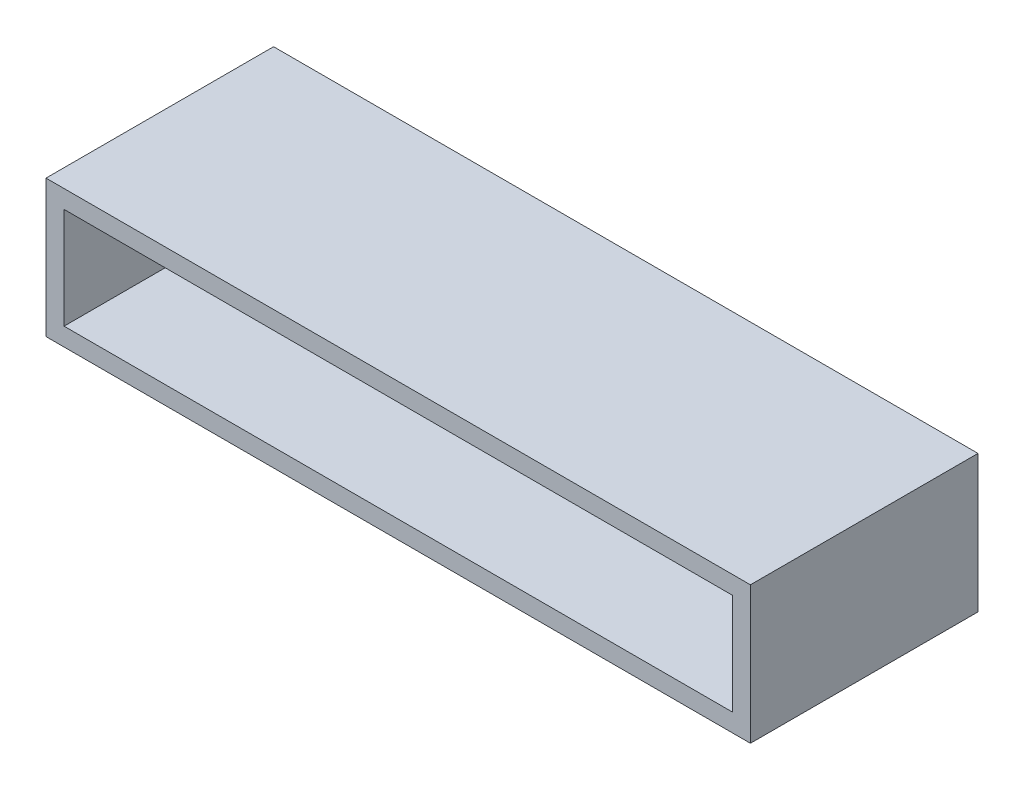
ISO-10303-21;
HEADER;
FILE_DESCRIPTION(('STEP AP214'),'2;1');
FILE_NAME('part.step','',(''),(''),'','','');
FILE_SCHEMA(('AUTOMOTIVE_DESIGN { 1 0 10303 214 1 1 1 1 }'));
ENDSEC;
DATA;
#1=APPLICATION_CONTEXT('core data for automotive mechanical design processes');
#2=APPLICATION_PROTOCOL_DEFINITION('international standard','automotive_design',2000,#1);
#3=PRODUCT_CONTEXT('',#1,'mechanical');
#4=PRODUCT('Part','Part','',(#3));
#5=PRODUCT_RELATED_PRODUCT_CATEGORY('part','',(#4));
#6=PRODUCT_DEFINITION_FORMATION('','',#4);
#7=PRODUCT_DEFINITION_CONTEXT('part definition',#1,'design');
#8=PRODUCT_DEFINITION('design','',#6,#7);
#9=PRODUCT_DEFINITION_SHAPE('','',#8);
#10=(LENGTH_UNIT() NAMED_UNIT(*) SI_UNIT(.MILLI.,.METRE.));
#11=(NAMED_UNIT(*) PLANE_ANGLE_UNIT() SI_UNIT($,.RADIAN.));
#12=(NAMED_UNIT(*) SI_UNIT($,.STERADIAN.) SOLID_ANGLE_UNIT());
#13=UNCERTAINTY_MEASURE_WITH_UNIT(LENGTH_MEASURE(1.E-05),#10,'distance_accuracy_value','');
#14=(GEOMETRIC_REPRESENTATION_CONTEXT(3) GLOBAL_UNCERTAINTY_ASSIGNED_CONTEXT((#13)) GLOBAL_UNIT_ASSIGNED_CONTEXT((#10,
#11,#12)) REPRESENTATION_CONTEXT('',''));
#15=CARTESIAN_POINT('',(0.,0.,0.));
#16=DIRECTION('',(0.,0.,1.));
#17=DIRECTION('',(1.,0.,0.));
#18=AXIS2_PLACEMENT_3D('',#15,#16,#17);
#19=CARTESIAN_POINT('',(44.,0.5,0.));
#20=DIRECTION('',(0.,1.,0.));
#21=DIRECTION('',(1.,0.,0.));
#22=AXIS2_PLACEMENT_3D('',#19,#20,#21);
#23=PLANE('',#22);
#24=CARTESIAN_POINT('',(44.5,0.5,6.300000333333));
#25=CARTESIAN_POINT('',(44.5,0.5,0.5));
#26=(BOUNDED_CURVE() B_SPLINE_CURVE(1,(#24,#25),.UNSPECIFIED.,.F.,
.F.) B_SPLINE_CURVE_WITH_KNOTS((2,2),(-6.300000426954,-0.499999994203),
.UNSPECIFIED.) CURVE() GEOMETRIC_REPRESENTATION_ITEM() RATIONAL_B_SPLINE_CURVE((1.,1.)) REPRESENTATION_ITEM(''));
#27=CARTESIAN_POINT('',(44.5,0.5,6.300000333333));
#28=VERTEX_POINT('',#27);
#29=CARTESIAN_POINT('',(44.5,0.5,0.5));
#30=VERTEX_POINT('',#29);
#31=EDGE_CURVE('E261',#28,#30,#26,.T.);
#32=ORIENTED_EDGE('',*,*,#31,.F.);
#33=CARTESIAN_POINT('',(63.,0.5,6.300000333333));
#34=CARTESIAN_POINT('',(44.5,0.5,6.300000333333));
#35=(BOUNDED_CURVE() B_SPLINE_CURVE(1,(#33,#34),.UNSPECIFIED.,.F.,
.F.) B_SPLINE_CURVE_WITH_KNOTS((2,2),(-19.,-0.5),
.UNSPECIFIED.) CURVE() GEOMETRIC_REPRESENTATION_ITEM() RATIONAL_B_SPLINE_CURVE((1.,1.)) REPRESENTATION_ITEM(''));
#36=CARTESIAN_POINT('',(63.,0.5,6.300000333333));
#37=VERTEX_POINT('',#36);
#38=EDGE_CURVE('E226',#37,#28,#35,.T.);
#39=ORIENTED_EDGE('',*,*,#38,.F.);
#40=CARTESIAN_POINT('',(63.,0.5,0.5));
#41=CARTESIAN_POINT('',(63.,0.5,6.300000333333));
#42=(BOUNDED_CURVE() B_SPLINE_CURVE(1,(#40,#41),.UNSPECIFIED.,.F.,
.F.) B_SPLINE_CURVE_WITH_KNOTS((2,2),(0.499999994203,6.300000426954),
.UNSPECIFIED.) CURVE() GEOMETRIC_REPRESENTATION_ITEM() RATIONAL_B_SPLINE_CURVE((1.,1.)) REPRESENTATION_ITEM(''));
#43=CARTESIAN_POINT('',(63.,0.5,0.5));
#44=VERTEX_POINT('',#43);
#45=EDGE_CURVE('E11',#44,#37,#42,.T.);
#46=ORIENTED_EDGE('',*,*,#45,.F.);
#47=CARTESIAN_POINT('',(44.5,0.5,0.5));
#48=CARTESIAN_POINT('',(63.,0.5,0.5));
#49=(BOUNDED_CURVE() B_SPLINE_CURVE(1,(#47,#48),.UNSPECIFIED.,.F.,
.F.) B_SPLINE_CURVE_WITH_KNOTS((2,2),(0.5,19.),
.UNSPECIFIED.) CURVE() GEOMETRIC_REPRESENTATION_ITEM() RATIONAL_B_SPLINE_CURVE((1.,1.)) REPRESENTATION_ITEM(''));
#50=EDGE_CURVE('E225',#30,#44,#49,.T.);
#51=ORIENTED_EDGE('',*,*,#50,.F.);
#52=EDGE_LOOP('',(#32,#39,#46,#51));
#53=FACE_BOUND('',#52,.T.);
#54=ADVANCED_FACE('F17',(#53),#23,.T.);
#55=CARTESIAN_POINT('',(63.,0.,0.));
#56=DIRECTION('',(-1.,0.,0.));
#57=DIRECTION('',(0.,0.,1.));
#58=AXIS2_PLACEMENT_3D('',#55,#56,#57);
#59=PLANE('',#58);
#60=CARTESIAN_POINT('',(63.,3.3,6.300000333333));
#61=CARTESIAN_POINT('',(63.,0.5,6.300000333333));
#62=(BOUNDED_CURVE() B_SPLINE_CURVE(1,(#60,#61),.UNSPECIFIED.,.F.,
.F.) B_SPLINE_CURVE_WITH_KNOTS((2,2),(-22.8,-20.),
.UNSPECIFIED.) CURVE() GEOMETRIC_REPRESENTATION_ITEM() RATIONAL_B_SPLINE_CURVE((1.,1.)) REPRESENTATION_ITEM(''));
#63=CARTESIAN_POINT('',(63.,3.3,6.300000333333));
#64=VERTEX_POINT('',#63);
#65=EDGE_CURVE('E215',#64,#37,#62,.T.);
#66=ORIENTED_EDGE('',*,*,#65,.F.);
#67=CARTESIAN_POINT('',(63.,3.3,0.5));
#68=CARTESIAN_POINT('',(63.,3.3,6.300000333333));
#69=(BOUNDED_CURVE() B_SPLINE_CURVE(1,(#67,#68),.UNSPECIFIED.,.F.,
.F.) B_SPLINE_CURVE_WITH_KNOTS((2,2),(0.499999994203,6.300000426954),
.UNSPECIFIED.) CURVE() GEOMETRIC_REPRESENTATION_ITEM() RATIONAL_B_SPLINE_CURVE((1.,1.)) REPRESENTATION_ITEM(''));
#70=CARTESIAN_POINT('',(63.,3.3,0.5));
#71=VERTEX_POINT('',#70);
#72=EDGE_CURVE('E27',#71,#64,#69,.T.);
#73=ORIENTED_EDGE('',*,*,#72,.F.);
#74=CARTESIAN_POINT('',(63.,0.5,0.5));
#75=CARTESIAN_POINT('',(63.,3.3,0.5));
#76=(BOUNDED_CURVE() B_SPLINE_CURVE(1,(#74,#75),.UNSPECIFIED.,.F.,
.F.) B_SPLINE_CURVE_WITH_KNOTS((2,2),(20.,22.8),
.UNSPECIFIED.) CURVE() GEOMETRIC_REPRESENTATION_ITEM() RATIONAL_B_SPLINE_CURVE((1.,1.)) REPRESENTATION_ITEM(''));
#77=EDGE_CURVE('E235',#44,#71,#76,.T.);
#78=ORIENTED_EDGE('',*,*,#77,.F.);
#79=ORIENTED_EDGE('',*,*,#45,.T.);
#80=EDGE_LOOP('',(#66,#73,#78,#79));
#81=FACE_BOUND('',#80,.T.);
#82=ADVANCED_FACE('F283',(#81),#59,.T.);
#83=CARTESIAN_POINT('',(63.5,3.3,0.));
#84=DIRECTION('',(0.,-1.,0.));
#85=DIRECTION('',(0.,0.,-1.));
#86=AXIS2_PLACEMENT_3D('',#83,#84,#85);
#87=PLANE('',#86);
#88=CARTESIAN_POINT('',(44.5,3.3,6.300000333333));
#89=CARTESIAN_POINT('',(63.,3.3,6.300000333333));
#90=(BOUNDED_CURVE() B_SPLINE_CURVE(1,(#88,#89),.UNSPECIFIED.,.F.,
.F.) B_SPLINE_CURVE_WITH_KNOTS((2,2),(0.5,19.),
.UNSPECIFIED.) CURVE() GEOMETRIC_REPRESENTATION_ITEM() RATIONAL_B_SPLINE_CURVE((1.,1.)) REPRESENTATION_ITEM(''));
#91=CARTESIAN_POINT('',(44.5,3.3,6.300000333333));
#92=VERTEX_POINT('',#91);
#93=EDGE_CURVE('E157',#92,#64,#90,.T.);
#94=ORIENTED_EDGE('',*,*,#93,.F.);
#95=CARTESIAN_POINT('',(44.5,3.3,0.5));
#96=CARTESIAN_POINT('',(44.5,3.3,6.299999533363));
#97=CARTESIAN_POINT('',(44.5,3.3,6.300000333333));
#98=(BOUNDED_CURVE() B_SPLINE_CURVE(1,(#95,#96,#97),.UNSPECIFIED.,.F.,
.F.) B_SPLINE_CURVE_WITH_KNOTS((2,1,2),(0.499999976193,6.299999700029,6.3000005),
.UNSPECIFIED.) CURVE() GEOMETRIC_REPRESENTATION_ITEM() RATIONAL_B_SPLINE_CURVE((1.,1.,1.)) REPRESENTATION_ITEM(''));
#99=CARTESIAN_POINT('',(44.5,3.3,0.5));
#100=VERTEX_POINT('',#99);
#101=EDGE_CURVE('E253',#100,#92,#98,.T.);
#102=ORIENTED_EDGE('',*,*,#101,.F.);
#103=CARTESIAN_POINT('',(63.,3.3,0.5));
#104=CARTESIAN_POINT('',(44.5,3.3,0.5));
#105=(BOUNDED_CURVE() B_SPLINE_CURVE(1,(#103,#104),.UNSPECIFIED.,.F.,
.F.) B_SPLINE_CURVE_WITH_KNOTS((2,2),(23.8,42.3),
.UNSPECIFIED.) CURVE() GEOMETRIC_REPRESENTATION_ITEM() RATIONAL_B_SPLINE_CURVE((1.,1.)) REPRESENTATION_ITEM(''));
#106=EDGE_CURVE('E244',#71,#100,#105,.T.);
#107=ORIENTED_EDGE('',*,*,#106,.F.);
#108=ORIENTED_EDGE('',*,*,#72,.T.);
#109=EDGE_LOOP('',(#94,#102,#107,#108));
#110=FACE_BOUND('',#109,.T.);
#111=ADVANCED_FACE('F281',(#110),#87,.T.);
#112=CARTESIAN_POINT('',(44.5,3.8,0.));
#113=DIRECTION('',(1.,0.,0.));
#114=DIRECTION('',(0.,1.,0.));
#115=AXIS2_PLACEMENT_3D('',#112,#113,#114);
#116=PLANE('',#115);
#117=ORIENTED_EDGE('',*,*,#101,.T.);
#118=CARTESIAN_POINT('',(44.5,0.5,6.300000333333));
#119=CARTESIAN_POINT('',(44.5,3.3,6.300000333333));
#120=(BOUNDED_CURVE() B_SPLINE_CURVE(1,(#118,#119),.UNSPECIFIED.,.F.,
.F.) B_SPLINE_CURVE_WITH_KNOTS((2,2),(0.5,3.3),
.UNSPECIFIED.) CURVE() GEOMETRIC_REPRESENTATION_ITEM() RATIONAL_B_SPLINE_CURVE((1.,1.)) REPRESENTATION_ITEM(''));
#121=EDGE_CURVE('E148',#28,#92,#120,.T.);
#122=ORIENTED_EDGE('',*,*,#121,.F.);
#123=ORIENTED_EDGE('',*,*,#31,.T.);
#124=CARTESIAN_POINT('',(44.5,3.3,0.5));
#125=CARTESIAN_POINT('',(44.5,0.5,0.5));
#126=(BOUNDED_CURVE() B_SPLINE_CURVE(1,(#124,#125),.UNSPECIFIED.,.F.,
.F.) B_SPLINE_CURVE_WITH_KNOTS((2,2),(-3.3,-0.5),
.UNSPECIFIED.) CURVE() GEOMETRIC_REPRESENTATION_ITEM() RATIONAL_B_SPLINE_CURVE((1.,1.)) REPRESENTATION_ITEM(''));
#127=EDGE_CURVE('E216',#100,#30,#126,.T.);
#128=ORIENTED_EDGE('',*,*,#127,.F.);
#129=EDGE_LOOP('',(#117,#122,#123,#128));
#130=FACE_BOUND('',#129,.T.);
#131=ADVANCED_FACE('F291',(#130),#116,.T.);
#132=CARTESIAN_POINT('',(44.,0.,0.5));
#133=DIRECTION('',(0.,0.,1.));
#134=DIRECTION('',(1.,0.,0.));
#135=AXIS2_PLACEMENT_3D('',#132,#133,#134);
#136=PLANE('',#135);
#137=ORIENTED_EDGE('',*,*,#127,.T.);
#138=ORIENTED_EDGE('',*,*,#50,.T.);
#139=ORIENTED_EDGE('',*,*,#77,.T.);
#140=ORIENTED_EDGE('',*,*,#106,.T.);
#141=EDGE_LOOP('',(#137,#138,#139,#140));
#142=FACE_BOUND('',#141,.T.);
#143=ADVANCED_FACE('F294',(#142),#136,.T.);
#144=CARTESIAN_POINT('',(44.,0.,6.3));
#145=DIRECTION('',(0.,0.,1.));
#146=DIRECTION('',(1.,0.,0.));
#147=AXIS2_PLACEMENT_3D('',#144,#145,#146);
#148=PLANE('',#147);
#149=CARTESIAN_POINT('',(63.5,0.,6.3));
#150=CARTESIAN_POINT('',(63.5,3.8,6.3));
#151=(BOUNDED_CURVE() B_SPLINE_CURVE(1,(#149,#150),.UNSPECIFIED.,.F.,
.F.) B_SPLINE_CURVE_WITH_KNOTS((2,2),(19.5,23.3),
.UNSPECIFIED.) CURVE() GEOMETRIC_REPRESENTATION_ITEM() RATIONAL_B_SPLINE_CURVE((1.,1.)) REPRESENTATION_ITEM(''));
#152=CARTESIAN_POINT('',(63.5,0.,6.3));
#153=VERTEX_POINT('',#152);
#154=CARTESIAN_POINT('',(63.5,3.8,6.3));
#155=VERTEX_POINT('',#154);
#156=EDGE_CURVE('E112',#153,#155,#151,.T.);
#157=ORIENTED_EDGE('',*,*,#156,.T.);
#158=CARTESIAN_POINT('',(63.5,3.8,6.3));
#159=CARTESIAN_POINT('',(44.,3.8,6.3));
#160=(BOUNDED_CURVE() B_SPLINE_CURVE(1,(#158,#159),.UNSPECIFIED.,.F.,
.F.) B_SPLINE_CURVE_WITH_KNOTS((2,2),(23.3,42.8),
.UNSPECIFIED.) CURVE() GEOMETRIC_REPRESENTATION_ITEM() RATIONAL_B_SPLINE_CURVE((1.,1.)) REPRESENTATION_ITEM(''));
#161=CARTESIAN_POINT('',(44.,3.8,6.3));
#162=VERTEX_POINT('',#161);
#163=EDGE_CURVE('E158',#155,#162,#160,.T.);
#164=ORIENTED_EDGE('',*,*,#163,.T.);
#165=CARTESIAN_POINT('',(44.,3.8,6.3));
#166=CARTESIAN_POINT('',(44.,0.,6.3));
#167=(BOUNDED_CURVE() B_SPLINE_CURVE(1,(#165,#166),.UNSPECIFIED.,.F.,
.F.) B_SPLINE_CURVE_WITH_KNOTS((2,2),(42.8,46.6),
.UNSPECIFIED.) CURVE() GEOMETRIC_REPRESENTATION_ITEM() RATIONAL_B_SPLINE_CURVE((1.,1.)) REPRESENTATION_ITEM(''));
#168=CARTESIAN_POINT('',(44.,0.,6.3));
#169=VERTEX_POINT('',#168);
#170=EDGE_CURVE('E144',#162,#169,#167,.T.);
#171=ORIENTED_EDGE('',*,*,#170,.T.);
#172=CARTESIAN_POINT('',(44.,0.,6.3));
#173=CARTESIAN_POINT('',(63.5,0.,6.3));
#174=(BOUNDED_CURVE() B_SPLINE_CURVE(1,(#172,#173),.UNSPECIFIED.,.F.,
.F.) B_SPLINE_CURVE_WITH_KNOTS((2,2),(0.,19.5),
.UNSPECIFIED.) CURVE() GEOMETRIC_REPRESENTATION_ITEM() RATIONAL_B_SPLINE_CURVE((1.,1.)) REPRESENTATION_ITEM(''));
#175=EDGE_CURVE('E115',#169,#153,#174,.T.);
#176=ORIENTED_EDGE('',*,*,#175,.T.);
#177=EDGE_LOOP('',(#157,#164,#171,#176));
#178=FACE_BOUND('',#177,.T.);
#179=ORIENTED_EDGE('',*,*,#121,.T.);
#180=ORIENTED_EDGE('',*,*,#93,.T.);
#181=ORIENTED_EDGE('',*,*,#65,.T.);
#182=ORIENTED_EDGE('',*,*,#38,.T.);
#183=EDGE_LOOP('',(#179,#180,#181,#182));
#184=FACE_BOUND('',#183,.T.);
#185=ADVANCED_FACE('F288',(#178,#184),#148,.T.);
#186=CARTESIAN_POINT('',(44.,0.,0.));
#187=DIRECTION('',(0.,-1.,0.));
#188=DIRECTION('',(0.,0.,-1.));
#189=AXIS2_PLACEMENT_3D('',#186,#187,#188);
#190=PLANE('',#189);
#191=CARTESIAN_POINT('',(44.,0.,0.));
#192=CARTESIAN_POINT('',(63.5,0.,0.));
#193=(BOUNDED_CURVE() B_SPLINE_CURVE(1,(#191,#192),.UNSPECIFIED.,.F.,
.F.) B_SPLINE_CURVE_WITH_KNOTS((2,2),(0.,19.5),
.UNSPECIFIED.) CURVE() GEOMETRIC_REPRESENTATION_ITEM() RATIONAL_B_SPLINE_CURVE((1.,1.)) REPRESENTATION_ITEM(''));
#194=CARTESIAN_POINT('',(44.,0.,0.));
#195=VERTEX_POINT('',#194);
#196=CARTESIAN_POINT('',(63.5,0.,0.));
#197=VERTEX_POINT('',#196);
#198=EDGE_CURVE('E118',#195,#197,#193,.T.);
#199=ORIENTED_EDGE('',*,*,#198,.T.);
#200=CARTESIAN_POINT('',(63.5,0.,0.));
#201=CARTESIAN_POINT('',(63.5,0.,6.3));
#202=(BOUNDED_CURVE() B_SPLINE_CURVE(1,(#200,#201),.UNSPECIFIED.,.F.,
.F.) B_SPLINE_CURVE_WITH_KNOTS((2,2),(0.,6.3),
.UNSPECIFIED.) CURVE() GEOMETRIC_REPRESENTATION_ITEM() RATIONAL_B_SPLINE_CURVE((1.,1.)) REPRESENTATION_ITEM(''));
#203=EDGE_CURVE('E105',#197,#153,#202,.T.);
#204=ORIENTED_EDGE('',*,*,#203,.T.);
#205=ORIENTED_EDGE('',*,*,#175,.F.);
#206=CARTESIAN_POINT('',(44.,0.,0.));
#207=CARTESIAN_POINT('',(44.,0.,6.3));
#208=(BOUNDED_CURVE() B_SPLINE_CURVE(1,(#206,#207),.UNSPECIFIED.,.F.,
.F.) B_SPLINE_CURVE_WITH_KNOTS((2,2),(0.,6.3),
.UNSPECIFIED.) CURVE() GEOMETRIC_REPRESENTATION_ITEM() RATIONAL_B_SPLINE_CURVE((1.,1.)) REPRESENTATION_ITEM(''));
#209=EDGE_CURVE('E121',#195,#169,#208,.T.);
#210=ORIENTED_EDGE('',*,*,#209,.F.);
#211=EDGE_LOOP('',(#199,#204,#205,#210));
#212=FACE_BOUND('',#211,.T.);
#213=ADVANCED_FACE('F119',(#212),#190,.T.);
#214=CARTESIAN_POINT('',(63.5,0.,0.));
#215=DIRECTION('',(1.,0.,0.));
#216=DIRECTION('',(0.,1.,0.));
#217=AXIS2_PLACEMENT_3D('',#214,#215,#216);
#218=PLANE('',#217);
#219=CARTESIAN_POINT('',(63.5,0.,0.));
#220=CARTESIAN_POINT('',(63.5,3.8,0.));
#221=(BOUNDED_CURVE() B_SPLINE_CURVE(1,(#219,#220),.UNSPECIFIED.,.F.,
.F.) B_SPLINE_CURVE_WITH_KNOTS((2,2),(19.5,23.3),
.UNSPECIFIED.) CURVE() GEOMETRIC_REPRESENTATION_ITEM() RATIONAL_B_SPLINE_CURVE((1.,1.)) REPRESENTATION_ITEM(''));
#222=CARTESIAN_POINT('',(63.5,3.8,0.));
#223=VERTEX_POINT('',#222);
#224=EDGE_CURVE('E110',#197,#223,#221,.T.);
#225=ORIENTED_EDGE('',*,*,#224,.T.);
#226=CARTESIAN_POINT('',(63.5,3.8,0.));
#227=CARTESIAN_POINT('',(63.5,3.8,6.3));
#228=(BOUNDED_CURVE() B_SPLINE_CURVE(1,(#226,#227),.UNSPECIFIED.,.F.,
.F.) B_SPLINE_CURVE_WITH_KNOTS((2,2),(0.,6.3),
.UNSPECIFIED.) CURVE() GEOMETRIC_REPRESENTATION_ITEM() RATIONAL_B_SPLINE_CURVE((1.,1.)) REPRESENTATION_ITEM(''));
#229=EDGE_CURVE('E165',#223,#155,#228,.T.);
#230=ORIENTED_EDGE('',*,*,#229,.T.);
#231=ORIENTED_EDGE('',*,*,#156,.F.);
#232=ORIENTED_EDGE('',*,*,#203,.F.);
#233=EDGE_LOOP('',(#225,#230,#231,#232));
#234=FACE_BOUND('',#233,.T.);
#235=ADVANCED_FACE('F107',(#234),#218,.T.);
#236=CARTESIAN_POINT('',(63.5,3.8,0.));
#237=DIRECTION('',(0.,1.,0.));
#238=DIRECTION('',(1.,0.,0.));
#239=AXIS2_PLACEMENT_3D('',#236,#237,#238);
#240=PLANE('',#239);
#241=CARTESIAN_POINT('',(63.5,3.8,0.));
#242=CARTESIAN_POINT('',(44.,3.8,0.));
#243=(BOUNDED_CURVE() B_SPLINE_CURVE(1,(#241,#242),.UNSPECIFIED.,.F.,
.F.) B_SPLINE_CURVE_WITH_KNOTS((2,2),(23.3,42.8),
.UNSPECIFIED.) CURVE() GEOMETRIC_REPRESENTATION_ITEM() RATIONAL_B_SPLINE_CURVE((1.,1.)) REPRESENTATION_ITEM(''));
#244=CARTESIAN_POINT('',(44.,3.8,0.));
#245=VERTEX_POINT('',#244);
#246=EDGE_CURVE('E129',#223,#245,#243,.T.);
#247=ORIENTED_EDGE('',*,*,#246,.T.);
#248=CARTESIAN_POINT('',(44.,3.8,0.));
#249=CARTESIAN_POINT('',(44.,3.8,6.3));
#250=(BOUNDED_CURVE() B_SPLINE_CURVE(1,(#248,#249),.UNSPECIFIED.,.F.,
.F.) B_SPLINE_CURVE_WITH_KNOTS((2,2),(0.,6.3),
.UNSPECIFIED.) CURVE() GEOMETRIC_REPRESENTATION_ITEM() RATIONAL_B_SPLINE_CURVE((1.,1.)) REPRESENTATION_ITEM(''));
#251=EDGE_CURVE('E166',#245,#162,#250,.T.);
#252=ORIENTED_EDGE('',*,*,#251,.T.);
#253=ORIENTED_EDGE('',*,*,#163,.F.);
#254=ORIENTED_EDGE('',*,*,#229,.F.);
#255=EDGE_LOOP('',(#247,#252,#253,#254));
#256=FACE_BOUND('',#255,.T.);
#257=ADVANCED_FACE('F331',(#256),#240,.T.);
#258=CARTESIAN_POINT('',(44.,3.8,0.));
#259=DIRECTION('',(-1.,0.,0.));
#260=DIRECTION('',(0.,0.,1.));
#261=AXIS2_PLACEMENT_3D('',#258,#259,#260);
#262=PLANE('',#261);
#263=CARTESIAN_POINT('',(44.,3.8,0.));
#264=CARTESIAN_POINT('',(44.,0.,0.));
#265=(BOUNDED_CURVE() B_SPLINE_CURVE(1,(#263,#264),.UNSPECIFIED.,.F.,
.F.) B_SPLINE_CURVE_WITH_KNOTS((2,2),(42.8,46.6),
.UNSPECIFIED.) CURVE() GEOMETRIC_REPRESENTATION_ITEM() RATIONAL_B_SPLINE_CURVE((1.,1.)) REPRESENTATION_ITEM(''));
#266=EDGE_CURVE('E138',#245,#195,#265,.T.);
#267=ORIENTED_EDGE('',*,*,#266,.T.);
#268=ORIENTED_EDGE('',*,*,#209,.T.);
#269=ORIENTED_EDGE('',*,*,#170,.F.);
#270=ORIENTED_EDGE('',*,*,#251,.F.);
#271=EDGE_LOOP('',(#267,#268,#269,#270));
#272=FACE_BOUND('',#271,.T.);
#273=ADVANCED_FACE('F337',(#272),#262,.T.);
#274=CARTESIAN_POINT('',(44.,0.,0.));
#275=DIRECTION('',(0.,0.,-1.));
#276=DIRECTION('',(0.,-1.,0.));
#277=AXIS2_PLACEMENT_3D('',#274,#275,#276);
#278=PLANE('',#277);
#279=ORIENTED_EDGE('',*,*,#266,.F.);
#280=ORIENTED_EDGE('',*,*,#246,.F.);
#281=ORIENTED_EDGE('',*,*,#224,.F.);
#282=ORIENTED_EDGE('',*,*,#198,.F.);
#283=EDGE_LOOP('',(#279,#280,#281,#282));
#284=FACE_BOUND('',#283,.T.);
#285=ADVANCED_FACE('F127',(#284),#278,.T.);
#286=CLOSED_SHELL('',(#54,#82,#111,#131,#143,#185,#213,#235,#257,#273,#285));
#287=MANIFOLD_SOLID_BREP('B1',#286);
#288=ADVANCED_BREP_SHAPE_REPRESENTATION('',(#18,#287),#14);
#289=SHAPE_DEFINITION_REPRESENTATION(#9,#288);
ENDSEC;
END-ISO-10303-21;
